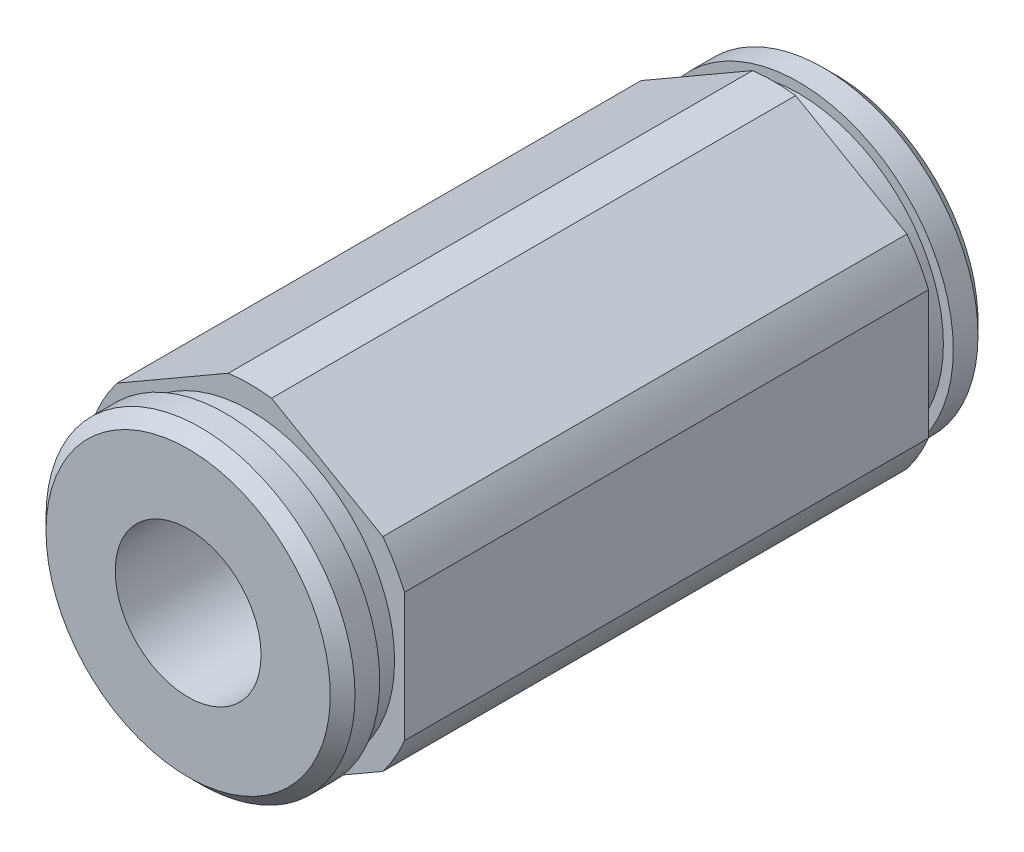
ISO-10303-21;
HEADER;
FILE_DESCRIPTION(('STEP AP214'),'2;1');
FILE_NAME('part.step','',(''),(''),'','','');
FILE_SCHEMA(('AUTOMOTIVE_DESIGN { 1 0 10303 214 1 1 1 1 }'));
ENDSEC;
DATA;
#1=APPLICATION_CONTEXT('core data for automotive mechanical design processes');
#2=APPLICATION_PROTOCOL_DEFINITION('international standard','automotive_design',2000,#1);
#3=PRODUCT_CONTEXT('',#1,'mechanical');
#4=PRODUCT('Part','Part','',(#3));
#5=PRODUCT_RELATED_PRODUCT_CATEGORY('part','',(#4));
#6=PRODUCT_DEFINITION_FORMATION('','',#4);
#7=PRODUCT_DEFINITION_CONTEXT('part definition',#1,'design');
#8=PRODUCT_DEFINITION('design','',#6,#7);
#9=PRODUCT_DEFINITION_SHAPE('','',#8);
#10=(LENGTH_UNIT() NAMED_UNIT(*) SI_UNIT(.MILLI.,.METRE.));
#11=(NAMED_UNIT(*) PLANE_ANGLE_UNIT() SI_UNIT($,.RADIAN.));
#12=(NAMED_UNIT(*) SI_UNIT($,.STERADIAN.) SOLID_ANGLE_UNIT());
#13=UNCERTAINTY_MEASURE_WITH_UNIT(LENGTH_MEASURE(1.E-05),#10,'distance_accuracy_value','');
#14=(GEOMETRIC_REPRESENTATION_CONTEXT(3) GLOBAL_UNCERTAINTY_ASSIGNED_CONTEXT((#13)) GLOBAL_UNIT_ASSIGNED_CONTEXT((#10,
#11,#12)) REPRESENTATION_CONTEXT('',''));
#15=CARTESIAN_POINT('',(0.,0.,0.));
#16=DIRECTION('',(0.,0.,1.));
#17=DIRECTION('',(1.,0.,0.));
#18=AXIS2_PLACEMENT_3D('',#15,#16,#17);
#19=CARTESIAN_POINT('',(0.,0.,10.7696));
#20=DIRECTION('',(0.,0.,1.));
#21=DIRECTION('',(1.,0.,0.));
#22=AXIS2_PLACEMENT_3D('',#19,#20,#21);
#23=PLANE('',#22);
#24=CARTESIAN_POINT('',(0.,0.,10.7696));
#25=DIRECTION('',(0.,0.,-1.));
#26=DIRECTION('',(-1.,0.,0.));
#27=AXIS2_PLACEMENT_3D('',#24,#25,#26);
#28=CIRCLE('',#27,5.9436);
#29=CARTESIAN_POINT('',(-5.9436,0.,10.7696));
#30=VERTEX_POINT('',#29);
#31=EDGE_CURVE('E172',#30,#30,#28,.T.);
#32=ORIENTED_EDGE('',*,*,#31,.T.);
#33=EDGE_LOOP('',(#32));
#34=FACE_BOUND('',#33,.T.);
#35=CARTESIAN_POINT('',(0.,0.,10.7696));
#36=DIRECTION('',(0.,0.,1.));
#37=DIRECTION('',(1.,0.,0.));
#38=AXIS2_PLACEMENT_3D('',#35,#36,#37);
#39=CIRCLE('',#38,6.87705);
#40=CARTESIAN_POINT('',(5.46158862213451,-4.17909875751589,10.7696));
#41=VERTEX_POINT('',#40);
#42=CARTESIAN_POINT('',(6.35,-2.64032511303059,10.7696));
#43=VERTEX_POINT('',#42);
#44=EDGE_CURVE('E144',#41,#43,#39,.T.);
#45=ORIENTED_EDGE('',*,*,#44,.T.);
#46=DIRECTION('',(0.,1.,0.));
#47=VECTOR('',#46,1.);
#48=CARTESIAN_POINT('',(6.35,-2.64032511303059,10.7696));
#49=LINE('',#48,#47);
#50=CARTESIAN_POINT('',(6.35,2.64032511303059,10.7696));
#51=VERTEX_POINT('',#50);
#52=EDGE_CURVE('E138',#43,#51,#49,.T.);
#53=ORIENTED_EDGE('',*,*,#52,.T.);
#54=CARTESIAN_POINT('',(0.,0.,10.7696));
#55=DIRECTION('',(0.,0.,1.));
#56=DIRECTION('',(1.,0.,0.));
#57=AXIS2_PLACEMENT_3D('',#54,#55,#56);
#58=CIRCLE('',#57,6.87705);
#59=CARTESIAN_POINT('',(5.46158862213451,4.17909875751589,10.7696));
#60=VERTEX_POINT('',#59);
#61=EDGE_CURVE('E141',#51,#60,#58,.T.);
#62=ORIENTED_EDGE('',*,*,#61,.T.);
#63=DIRECTION('',(-0.866025403784439,0.499999999999999,0.));
#64=VECTOR('',#63,1.);
#65=CARTESIAN_POINT('',(5.46158862213451,4.17909875751589,10.7696));
#66=LINE('',#65,#64);
#67=CARTESIAN_POINT('',(0.888411377865485,6.81942387054648,10.7696));
#68=VERTEX_POINT('',#67);
#69=EDGE_CURVE('E59',#60,#68,#66,.T.);
#70=ORIENTED_EDGE('',*,*,#69,.T.);
#71=CARTESIAN_POINT('',(0.,0.,10.7696));
#72=DIRECTION('',(0.,0.,1.));
#73=DIRECTION('',(1.,0.,0.));
#74=AXIS2_PLACEMENT_3D('',#71,#72,#73);
#75=CIRCLE('',#74,6.87705);
#76=CARTESIAN_POINT('',(-0.88841137786549,6.81942387054648,10.7696));
#77=VERTEX_POINT('',#76);
#78=EDGE_CURVE('E207',#68,#77,#75,.T.);
#79=ORIENTED_EDGE('',*,*,#78,.T.);
#80=DIRECTION('',(-0.866025403784439,-0.5,0.));
#81=VECTOR('',#80,1.);
#82=CARTESIAN_POINT('',(-0.88841137786549,6.81942387054648,10.7696));
#83=LINE('',#82,#81);
#84=CARTESIAN_POINT('',(-5.46158862213451,4.17909875751589,10.7696));
#85=VERTEX_POINT('',#84);
#86=EDGE_CURVE('E113',#77,#85,#83,.T.);
#87=ORIENTED_EDGE('',*,*,#86,.T.);
#88=CARTESIAN_POINT('',(0.,0.,10.7696));
#89=DIRECTION('',(0.,0.,1.));
#90=DIRECTION('',(1.,0.,0.));
#91=AXIS2_PLACEMENT_3D('',#88,#89,#90);
#92=CIRCLE('',#91,6.87705);
#93=CARTESIAN_POINT('',(-6.35,2.64032511303059,10.7696));
#94=VERTEX_POINT('',#93);
#95=EDGE_CURVE('E261',#85,#94,#92,.T.);
#96=ORIENTED_EDGE('',*,*,#95,.T.);
#97=DIRECTION('',(0.,-1.,0.));
#98=VECTOR('',#97,1.);
#99=CARTESIAN_POINT('',(-6.35,2.64032511303059,10.7696));
#100=LINE('',#99,#98);
#101=CARTESIAN_POINT('',(-6.35,-2.64032511303059,10.7696));
#102=VERTEX_POINT('',#101);
#103=EDGE_CURVE('E257',#94,#102,#100,.T.);
#104=ORIENTED_EDGE('',*,*,#103,.T.);
#105=CARTESIAN_POINT('',(0.,0.,10.7696));
#106=DIRECTION('',(0.,0.,1.));
#107=DIRECTION('',(1.,0.,0.));
#108=AXIS2_PLACEMENT_3D('',#105,#106,#107);
#109=CIRCLE('',#108,6.87705);
#110=CARTESIAN_POINT('',(-5.46158862213451,-4.17909875751589,10.7696));
#111=VERTEX_POINT('',#110);
#112=EDGE_CURVE('E260',#102,#111,#109,.T.);
#113=ORIENTED_EDGE('',*,*,#112,.T.);
#114=DIRECTION('',(0.866025403784438,-0.5,0.));
#115=VECTOR('',#114,1.);
#116=CARTESIAN_POINT('',(-5.46158862213451,-4.17909875751589,10.7696));
#117=LINE('',#116,#115);
#118=CARTESIAN_POINT('',(-0.888411377865495,-6.81942387054648,10.7696));
#119=VERTEX_POINT('',#118);
#120=EDGE_CURVE('E265',#111,#119,#117,.T.);
#121=ORIENTED_EDGE('',*,*,#120,.T.);
#122=CARTESIAN_POINT('',(0.,0.,10.7696));
#123=DIRECTION('',(0.,0.,1.));
#124=DIRECTION('',(1.,0.,0.));
#125=AXIS2_PLACEMENT_3D('',#122,#123,#124);
#126=CIRCLE('',#125,6.87705);
#127=CARTESIAN_POINT('',(0.888411377865487,-6.81942387054648,10.7696));
#128=VERTEX_POINT('',#127);
#129=EDGE_CURVE('E272',#119,#128,#126,.T.);
#130=ORIENTED_EDGE('',*,*,#129,.T.);
#131=DIRECTION('',(0.866025403784439,0.5,0.));
#132=VECTOR('',#131,1.);
#133=CARTESIAN_POINT('',(0.88841137786549,-6.81942387054648,10.7696));
#134=LINE('',#133,#132);
#135=EDGE_CURVE('E275',#128,#41,#134,.T.);
#136=ORIENTED_EDGE('',*,*,#135,.T.);
#137=EDGE_LOOP('',(#45,#53,#62,#70,#79,#87,#96,#104,#113,#121,#130,#136));
#138=FACE_BOUND('',#137,.T.);
#139=ADVANCED_FACE('F41',(#34,#138),#23,.T.);
#140=CARTESIAN_POINT('',(-0.88841137786549,6.81942387054648,10.7696));
#141=DIRECTION('',(0.5,-0.866025403784439,0.));
#142=DIRECTION('',(0.866025403784439,0.5,0.));
#143=AXIS2_PLACEMENT_3D('',#140,#141,#142);
#144=PLANE('',#143);
#145=DIRECTION('',(0.,0.,-1.));
#146=VECTOR('',#145,1.);
#147=CARTESIAN_POINT('',(-5.46158862213451,4.17909875751589,10.7696));
#148=LINE('',#147,#146);
#149=CARTESIAN_POINT('',(-5.46158862213451,4.17909875751589,-10.7696));
#150=VERTEX_POINT('',#149);
#151=EDGE_CURVE('E237',#85,#150,#148,.T.);
#152=ORIENTED_EDGE('',*,*,#151,.F.);
#153=ORIENTED_EDGE('',*,*,#86,.F.);
#154=DIRECTION('',(0.,0.,-1.));
#155=VECTOR('',#154,1.);
#156=CARTESIAN_POINT('',(-0.88841137786549,6.81942387054648,10.7696));
#157=LINE('',#156,#155);
#158=CARTESIAN_POINT('',(-0.88841137786549,6.81942387054648,-10.7696));
#159=VERTEX_POINT('',#158);
#160=EDGE_CURVE('E44',#77,#159,#157,.T.);
#161=ORIENTED_EDGE('',*,*,#160,.T.);
#162=DIRECTION('',(-0.866025403784439,-0.5,0.));
#163=VECTOR('',#162,1.);
#164=CARTESIAN_POINT('',(-0.88841137786549,6.81942387054648,-10.7696));
#165=LINE('',#164,#163);
#166=EDGE_CURVE('E171',#159,#150,#165,.T.);
#167=ORIENTED_EDGE('',*,*,#166,.T.);
#168=EDGE_LOOP('',(#152,#153,#161,#167));
#169=FACE_BOUND('',#168,.T.);
#170=ADVANCED_FACE('F245',(#169),#144,.F.);
#171=CARTESIAN_POINT('',(-6.35,2.64032511303059,10.7696));
#172=DIRECTION('',(1.,0.,0.));
#173=DIRECTION('',(0.,0.,-1.));
#174=AXIS2_PLACEMENT_3D('',#171,#172,#173);
#175=PLANE('',#174);
#176=DIRECTION('',(0.,0.,-1.));
#177=VECTOR('',#176,1.);
#178=CARTESIAN_POINT('',(-6.35,-2.64032511303059,10.7696));
#179=LINE('',#178,#177);
#180=CARTESIAN_POINT('',(-6.35,-2.64032511303059,-10.7696));
#181=VERTEX_POINT('',#180);
#182=EDGE_CURVE('E230',#102,#181,#179,.T.);
#183=ORIENTED_EDGE('',*,*,#182,.F.);
#184=ORIENTED_EDGE('',*,*,#103,.F.);
#185=DIRECTION('',(0.,0.,-1.));
#186=VECTOR('',#185,1.);
#187=CARTESIAN_POINT('',(-6.35,2.64032511303059,10.7696));
#188=LINE('',#187,#186);
#189=CARTESIAN_POINT('',(-6.35,2.64032511303059,-10.7696));
#190=VERTEX_POINT('',#189);
#191=EDGE_CURVE('E234',#94,#190,#188,.T.);
#192=ORIENTED_EDGE('',*,*,#191,.T.);
#193=DIRECTION('',(0.,-1.,0.));
#194=VECTOR('',#193,1.);
#195=CARTESIAN_POINT('',(-6.35,2.64032511303059,-10.7696));
#196=LINE('',#195,#194);
#197=EDGE_CURVE('E179',#190,#181,#196,.T.);
#198=ORIENTED_EDGE('',*,*,#197,.T.);
#199=EDGE_LOOP('',(#183,#184,#192,#198));
#200=FACE_BOUND('',#199,.T.);
#201=ADVANCED_FACE('F256',(#200),#175,.F.);
#202=CARTESIAN_POINT('',(-5.46158862213451,-4.17909875751589,10.7696));
#203=DIRECTION('',(0.5,0.866025403784439,0.));
#204=DIRECTION('',(-0.866025403784439,0.5,0.));
#205=AXIS2_PLACEMENT_3D('',#202,#203,#204);
#206=PLANE('',#205);
#207=DIRECTION('',(0.,0.,-1.));
#208=VECTOR('',#207,1.);
#209=CARTESIAN_POINT('',(-0.888411377865495,-6.81942387054648,10.7696));
#210=LINE('',#209,#208);
#211=CARTESIAN_POINT('',(-0.888411377865495,-6.81942387054648,-10.7696));
#212=VERTEX_POINT('',#211);
#213=EDGE_CURVE('E222',#119,#212,#210,.T.);
#214=ORIENTED_EDGE('',*,*,#213,.F.);
#215=ORIENTED_EDGE('',*,*,#120,.F.);
#216=DIRECTION('',(0.,0.,-1.));
#217=VECTOR('',#216,1.);
#218=CARTESIAN_POINT('',(-5.46158862213451,-4.17909875751589,10.7696));
#219=LINE('',#218,#217);
#220=CARTESIAN_POINT('',(-5.46158862213451,-4.17909875751589,-10.7696));
#221=VERTEX_POINT('',#220);
#222=EDGE_CURVE('E226',#111,#221,#219,.T.);
#223=ORIENTED_EDGE('',*,*,#222,.T.);
#224=DIRECTION('',(0.866025403784438,-0.5,0.));
#225=VECTOR('',#224,1.);
#226=CARTESIAN_POINT('',(-5.46158862213451,-4.17909875751589,-10.7696));
#227=LINE('',#226,#225);
#228=EDGE_CURVE('E186',#221,#212,#227,.T.);
#229=ORIENTED_EDGE('',*,*,#228,.T.);
#230=EDGE_LOOP('',(#214,#215,#223,#229));
#231=FACE_BOUND('',#230,.T.);
#232=ADVANCED_FACE('F378',(#231),#206,.F.);
#233=CARTESIAN_POINT('',(0.88841137786549,-6.81942387054648,10.7696));
#234=DIRECTION('',(-0.5,0.866025403784439,0.));
#235=DIRECTION('',(-0.866025403784439,-0.5,0.));
#236=AXIS2_PLACEMENT_3D('',#233,#234,#235);
#237=PLANE('',#236);
#238=DIRECTION('',(0.,0.,-1.));
#239=VECTOR('',#238,1.);
#240=CARTESIAN_POINT('',(5.46158862213451,-4.17909875751589,10.7696));
#241=LINE('',#240,#239);
#242=CARTESIAN_POINT('',(5.46158862213451,-4.17909875751589,-10.7696));
#243=VERTEX_POINT('',#242);
#244=EDGE_CURVE('E214',#41,#243,#241,.T.);
#245=ORIENTED_EDGE('',*,*,#244,.F.);
#246=ORIENTED_EDGE('',*,*,#135,.F.);
#247=DIRECTION('',(0.,0.,-1.));
#248=VECTOR('',#247,1.);
#249=CARTESIAN_POINT('',(0.888411377865487,-6.81942387054648,10.7696));
#250=LINE('',#249,#248);
#251=CARTESIAN_POINT('',(0.888411377865487,-6.81942387054648,-10.7696));
#252=VERTEX_POINT('',#251);
#253=EDGE_CURVE('E218',#128,#252,#250,.T.);
#254=ORIENTED_EDGE('',*,*,#253,.T.);
#255=DIRECTION('',(0.866025403784439,0.5,0.));
#256=VECTOR('',#255,1.);
#257=CARTESIAN_POINT('',(0.88841137786549,-6.81942387054648,-10.7696));
#258=LINE('',#257,#256);
#259=EDGE_CURVE('E193',#252,#243,#258,.T.);
#260=ORIENTED_EDGE('',*,*,#259,.T.);
#261=EDGE_LOOP('',(#245,#246,#254,#260));
#262=FACE_BOUND('',#261,.T.);
#263=ADVANCED_FACE('F283',(#262),#237,.F.);
#264=CARTESIAN_POINT('',(6.35,-2.64032511303059,10.7696));
#265=DIRECTION('',(-1.,0.,0.));
#266=DIRECTION('',(0.,0.,1.));
#267=AXIS2_PLACEMENT_3D('',#264,#265,#266);
#268=PLANE('',#267);
#269=ORIENTED_EDGE('',*,*,#52,.F.);
#270=DIRECTION('',(0.,0.,-1.));
#271=VECTOR('',#270,1.);
#272=CARTESIAN_POINT('',(6.35,-2.64032511303059,10.7696));
#273=LINE('',#272,#271);
#274=CARTESIAN_POINT('',(6.35,-2.64032511303059,-10.7696));
#275=VERTEX_POINT('',#274);
#276=EDGE_CURVE('E156',#43,#275,#273,.T.);
#277=ORIENTED_EDGE('',*,*,#276,.T.);
#278=DIRECTION('',(0.,1.,0.));
#279=VECTOR('',#278,1.);
#280=CARTESIAN_POINT('',(6.35,-2.64032511303059,-10.7696));
#281=LINE('',#280,#279);
#282=CARTESIAN_POINT('',(6.35,2.64032511303059,-10.7696));
#283=VERTEX_POINT('',#282);
#284=EDGE_CURVE('E153',#275,#283,#281,.T.);
#285=ORIENTED_EDGE('',*,*,#284,.T.);
#286=DIRECTION('',(0.,0.,-1.));
#287=VECTOR('',#286,1.);
#288=CARTESIAN_POINT('',(6.35,2.64032511303059,10.7696));
#289=LINE('',#288,#287);
#290=EDGE_CURVE('E151',#51,#283,#289,.T.);
#291=ORIENTED_EDGE('',*,*,#290,.F.);
#292=EDGE_LOOP('',(#269,#277,#285,#291));
#293=FACE_BOUND('',#292,.T.);
#294=ADVANCED_FACE('F152',(#293),#268,.F.);
#295=CARTESIAN_POINT('',(5.46158862213451,4.17909875751589,10.7696));
#296=DIRECTION('',(-0.499999999999999,-0.866025403784439,0.));
#297=DIRECTION('',(0.866025403784439,-0.499999999999999,0.));
#298=AXIS2_PLACEMENT_3D('',#295,#296,#297);
#299=PLANE('',#298);
#300=DIRECTION('',(0.,0.,-1.));
#301=VECTOR('',#300,1.);
#302=CARTESIAN_POINT('',(0.888411377865485,6.81942387054648,10.7696));
#303=LINE('',#302,#301);
#304=CARTESIAN_POINT('',(0.888411377865485,6.81942387054648,-10.7696));
#305=VERTEX_POINT('',#304);
#306=EDGE_CURVE('E163',#68,#305,#303,.T.);
#307=ORIENTED_EDGE('',*,*,#306,.F.);
#308=ORIENTED_EDGE('',*,*,#69,.F.);
#309=DIRECTION('',(0.,0.,-1.));
#310=VECTOR('',#309,1.);
#311=CARTESIAN_POINT('',(5.46158862213451,4.17909875751589,10.7696));
#312=LINE('',#311,#310);
#313=CARTESIAN_POINT('',(5.46158862213451,4.17909875751589,-10.7696));
#314=VERTEX_POINT('',#313);
#315=EDGE_CURVE('E157',#60,#314,#312,.T.);
#316=ORIENTED_EDGE('',*,*,#315,.T.);
#317=DIRECTION('',(-0.866025403784439,0.499999999999999,0.));
#318=VECTOR('',#317,1.);
#319=CARTESIAN_POINT('',(5.46158862213451,4.17909875751589,-10.7696));
#320=LINE('',#319,#318);
#321=EDGE_CURVE('E100',#314,#305,#320,.T.);
#322=ORIENTED_EDGE('',*,*,#321,.T.);
#323=EDGE_LOOP('',(#307,#308,#316,#322));
#324=FACE_BOUND('',#323,.T.);
#325=ADVANCED_FACE('F288',(#324),#299,.F.);
#326=CARTESIAN_POINT('',(0.,0.,10.7696));
#327=DIRECTION('',(0.,0.,-1.));
#328=DIRECTION('',(-1.,0.,0.));
#329=AXIS2_PLACEMENT_3D('',#326,#327,#328);
#330=CYLINDRICAL_SURFACE('',#329,6.87705);
#331=CARTESIAN_POINT('',(0.,0.,-10.7696));
#332=DIRECTION('',(0.,0.,1.));
#333=DIRECTION('',(1.,0.,0.));
#334=AXIS2_PLACEMENT_3D('',#331,#332,#333);
#335=CIRCLE('',#334,6.87705);
#336=EDGE_CURVE('E167',#305,#159,#335,.T.);
#337=ORIENTED_EDGE('',*,*,#336,.T.);
#338=ORIENTED_EDGE('',*,*,#160,.F.);
#339=ORIENTED_EDGE('',*,*,#78,.F.);
#340=ORIENTED_EDGE('',*,*,#306,.T.);
#341=EDGE_LOOP('',(#337,#338,#339,#340));
#342=FACE_BOUND('',#341,.T.);
#343=ADVANCED_FACE('F248',(#342),#330,.T.);
#344=CARTESIAN_POINT('',(0.,0.,10.7696));
#345=DIRECTION('',(0.,0.,-1.));
#346=DIRECTION('',(-1.,0.,0.));
#347=AXIS2_PLACEMENT_3D('',#344,#345,#346);
#348=CYLINDRICAL_SURFACE('',#347,6.87705);
#349=CARTESIAN_POINT('',(0.,0.,-10.7696));
#350=DIRECTION('',(0.,0.,1.));
#351=DIRECTION('',(1.,0.,0.));
#352=AXIS2_PLACEMENT_3D('',#349,#350,#351);
#353=CIRCLE('',#352,6.87705);
#354=EDGE_CURVE('E175',#150,#190,#353,.T.);
#355=ORIENTED_EDGE('',*,*,#354,.T.);
#356=ORIENTED_EDGE('',*,*,#191,.F.);
#357=ORIENTED_EDGE('',*,*,#95,.F.);
#358=ORIENTED_EDGE('',*,*,#151,.T.);
#359=EDGE_LOOP('',(#355,#356,#357,#358));
#360=FACE_BOUND('',#359,.T.);
#361=ADVANCED_FACE('F252',(#360),#348,.T.);
#362=CARTESIAN_POINT('',(0.,0.,10.7696));
#363=DIRECTION('',(0.,0.,-1.));
#364=DIRECTION('',(-1.,0.,0.));
#365=AXIS2_PLACEMENT_3D('',#362,#363,#364);
#366=CYLINDRICAL_SURFACE('',#365,6.87705);
#367=CARTESIAN_POINT('',(0.,0.,-10.7696));
#368=DIRECTION('',(0.,0.,1.));
#369=DIRECTION('',(1.,0.,0.));
#370=AXIS2_PLACEMENT_3D('',#367,#368,#369);
#371=CIRCLE('',#370,6.87705);
#372=EDGE_CURVE('E182',#181,#221,#371,.T.);
#373=ORIENTED_EDGE('',*,*,#372,.T.);
#374=ORIENTED_EDGE('',*,*,#222,.F.);
#375=ORIENTED_EDGE('',*,*,#112,.F.);
#376=ORIENTED_EDGE('',*,*,#182,.T.);
#377=EDGE_LOOP('',(#373,#374,#375,#376));
#378=FACE_BOUND('',#377,.T.);
#379=ADVANCED_FACE('F415',(#378),#366,.T.);
#380=CARTESIAN_POINT('',(0.,0.,10.7696));
#381=DIRECTION('',(0.,0.,-1.));
#382=DIRECTION('',(-1.,0.,0.));
#383=AXIS2_PLACEMENT_3D('',#380,#381,#382);
#384=CYLINDRICAL_SURFACE('',#383,6.87705);
#385=CARTESIAN_POINT('',(0.,0.,-10.7696));
#386=DIRECTION('',(0.,0.,1.));
#387=DIRECTION('',(1.,0.,0.));
#388=AXIS2_PLACEMENT_3D('',#385,#386,#387);
#389=CIRCLE('',#388,6.87705);
#390=EDGE_CURVE('E189',#212,#252,#389,.T.);
#391=ORIENTED_EDGE('',*,*,#390,.T.);
#392=ORIENTED_EDGE('',*,*,#253,.F.);
#393=ORIENTED_EDGE('',*,*,#129,.F.);
#394=ORIENTED_EDGE('',*,*,#213,.T.);
#395=EDGE_LOOP('',(#391,#392,#393,#394));
#396=FACE_BOUND('',#395,.T.);
#397=ADVANCED_FACE('F410',(#396),#384,.T.);
#398=CARTESIAN_POINT('',(0.,0.,10.7696));
#399=DIRECTION('',(0.,0.,-1.));
#400=DIRECTION('',(-1.,0.,0.));
#401=AXIS2_PLACEMENT_3D('',#398,#399,#400);
#402=CYLINDRICAL_SURFACE('',#401,6.87705);
#403=CARTESIAN_POINT('',(0.,0.,-10.7696));
#404=DIRECTION('',(0.,0.,1.));
#405=DIRECTION('',(1.,0.,0.));
#406=AXIS2_PLACEMENT_3D('',#403,#404,#405);
#407=CIRCLE('',#406,6.87705);
#408=EDGE_CURVE('E196',#243,#275,#407,.T.);
#409=ORIENTED_EDGE('',*,*,#408,.T.);
#410=ORIENTED_EDGE('',*,*,#276,.F.);
#411=ORIENTED_EDGE('',*,*,#44,.F.);
#412=ORIENTED_EDGE('',*,*,#244,.T.);
#413=EDGE_LOOP('',(#409,#410,#411,#412));
#414=FACE_BOUND('',#413,.T.);
#415=ADVANCED_FACE('F286',(#414),#402,.T.);
#416=CARTESIAN_POINT('',(0.,0.,10.7696));
#417=DIRECTION('',(0.,0.,-1.));
#418=DIRECTION('',(-1.,0.,0.));
#419=AXIS2_PLACEMENT_3D('',#416,#417,#418);
#420=CYLINDRICAL_SURFACE('',#419,6.87705);
#421=CARTESIAN_POINT('',(0.,0.,-10.7696));
#422=DIRECTION('',(0.,0.,1.));
#423=DIRECTION('',(1.,0.,0.));
#424=AXIS2_PLACEMENT_3D('',#421,#422,#423);
#425=CIRCLE('',#424,6.87705);
#426=EDGE_CURVE('E202',#283,#314,#425,.T.);
#427=ORIENTED_EDGE('',*,*,#426,.T.);
#428=ORIENTED_EDGE('',*,*,#315,.F.);
#429=ORIENTED_EDGE('',*,*,#61,.F.);
#430=ORIENTED_EDGE('',*,*,#290,.T.);
#431=EDGE_LOOP('',(#427,#428,#429,#430));
#432=FACE_BOUND('',#431,.T.);
#433=ADVANCED_FACE('F159',(#432),#420,.T.);
#434=CARTESIAN_POINT('',(0.,0.,-10.7696));
#435=DIRECTION('',(0.,0.,1.));
#436=DIRECTION('',(1.,0.,0.));
#437=AXIS2_PLACEMENT_3D('',#434,#435,#436);
#438=PLANE('',#437);
#439=CARTESIAN_POINT('',(0.,0.,-10.7696));
#440=DIRECTION('',(0.,0.,-1.));
#441=DIRECTION('',(-1.,0.,0.));
#442=AXIS2_PLACEMENT_3D('',#439,#440,#441);
#443=CIRCLE('',#442,5.9436);
#444=CARTESIAN_POINT('',(-5.9436,0.,-10.7696));
#445=VERTEX_POINT('',#444);
#446=EDGE_CURVE('E11',#445,#445,#443,.T.);
#447=ORIENTED_EDGE('',*,*,#446,.F.);
#448=EDGE_LOOP('',(#447));
#449=FACE_BOUND('',#448,.T.);
#450=ORIENTED_EDGE('',*,*,#321,.F.);
#451=ORIENTED_EDGE('',*,*,#426,.F.);
#452=ORIENTED_EDGE('',*,*,#284,.F.);
#453=ORIENTED_EDGE('',*,*,#408,.F.);
#454=ORIENTED_EDGE('',*,*,#259,.F.);
#455=ORIENTED_EDGE('',*,*,#390,.F.);
#456=ORIENTED_EDGE('',*,*,#228,.F.);
#457=ORIENTED_EDGE('',*,*,#372,.F.);
#458=ORIENTED_EDGE('',*,*,#197,.F.);
#459=ORIENTED_EDGE('',*,*,#354,.F.);
#460=ORIENTED_EDGE('',*,*,#166,.F.);
#461=ORIENTED_EDGE('',*,*,#336,.F.);
#462=EDGE_LOOP('',(#450,#451,#452,#453,#454,#455,#456,#457,#458,#459,#460,#461));
#463=FACE_BOUND('',#462,.T.);
#464=ADVANCED_FACE('F249',(#449,#463),#438,.F.);
#465=CARTESIAN_POINT('',(0.,0.,-38.2778));
#466=DIRECTION('',(0.,0.,-1.));
#467=DIRECTION('',(-1.,0.,0.));
#468=AXIS2_PLACEMENT_3D('',#465,#466,#467);
#469=CYLINDRICAL_SURFACE('',#468,5.9436);
#470=CARTESIAN_POINT('',(0.,0.,11.7856));
#471=DIRECTION('',(0.,0.,-1.));
#472=DIRECTION('',(-1.,0.,0.));
#473=AXIS2_PLACEMENT_3D('',#470,#471,#472);
#474=CIRCLE('',#473,5.9436);
#475=CARTESIAN_POINT('',(-5.9436,0.,11.7856));
#476=VERTEX_POINT('',#475);
#477=EDGE_CURVE('E296',#476,#476,#474,.T.);
#478=ORIENTED_EDGE('',*,*,#477,.T.);
#479=EDGE_LOOP('',(#478));
#480=FACE_BOUND('',#479,.T.);
#481=ORIENTED_EDGE('',*,*,#31,.F.);
#482=EDGE_LOOP('',(#481));
#483=FACE_BOUND('',#482,.T.);
#484=ADVANCED_FACE('F361',(#480,#483),#469,.T.);
#485=CARTESIAN_POINT('',(0.,5.9436,11.7856));
#486=DIRECTION('',(0.,0.,-1.));
#487=DIRECTION('',(-1.,0.,0.));
#488=AXIS2_PLACEMENT_3D('',#485,#486,#487);
#489=PLANE('',#488);
#490=CARTESIAN_POINT('',(0.,0.,11.7856));
#491=DIRECTION('',(0.,0.,-1.));
#492=DIRECTION('',(-1.,0.,0.));
#493=AXIS2_PLACEMENT_3D('',#490,#491,#492);
#494=CIRCLE('',#493,6.35);
#495=CARTESIAN_POINT('',(-6.35,0.,11.7856));
#496=VERTEX_POINT('',#495);
#497=EDGE_CURVE('E300',#496,#496,#494,.T.);
#498=ORIENTED_EDGE('',*,*,#497,.T.);
#499=EDGE_LOOP('',(#498));
#500=FACE_BOUND('',#499,.T.);
#501=ORIENTED_EDGE('',*,*,#477,.F.);
#502=EDGE_LOOP('',(#501));
#503=FACE_BOUND('',#502,.T.);
#504=ADVANCED_FACE('F355',(#500,#503),#489,.T.);
#505=CARTESIAN_POINT('',(0.,0.,-38.2778));
#506=DIRECTION('',(0.,0.,-1.));
#507=DIRECTION('',(-1.,0.,0.));
#508=AXIS2_PLACEMENT_3D('',#505,#506,#507);
#509=CYLINDRICAL_SURFACE('',#508,6.35);
#510=CARTESIAN_POINT('',(0.,0.,12.8016));
#511=DIRECTION('',(0.,0.,-1.));
#512=DIRECTION('',(-1.,0.,0.));
#513=AXIS2_PLACEMENT_3D('',#510,#511,#512);
#514=CIRCLE('',#513,6.35);
#515=CARTESIAN_POINT('',(-6.35,0.,12.8016));
#516=VERTEX_POINT('',#515);
#517=EDGE_CURVE('E304',#516,#516,#514,.T.);
#518=ORIENTED_EDGE('',*,*,#517,.T.);
#519=EDGE_LOOP('',(#518));
#520=FACE_BOUND('',#519,.T.);
#521=ORIENTED_EDGE('',*,*,#497,.F.);
#522=EDGE_LOOP('',(#521));
#523=FACE_BOUND('',#522,.T.);
#524=ADVANCED_FACE('F349',(#520,#523),#509,.T.);
#525=CARTESIAN_POINT('',(0.,0.,12.8016));
#526=DIRECTION('',(0.,0.,-1.));
#527=DIRECTION('',(-1.,0.,0.));
#528=AXIS2_PLACEMENT_3D('',#525,#526,#527);
#529=CONICAL_SURFACE('',#528,6.35,0.785398163397447);
#530=CARTESIAN_POINT('',(0.,0.,13.3096));
#531=DIRECTION('',(0.,0.,-1.));
#532=DIRECTION('',(-1.,0.,0.));
#533=AXIS2_PLACEMENT_3D('',#530,#531,#532);
#534=CIRCLE('',#533,5.842);
#535=CARTESIAN_POINT('',(-5.842,0.,13.3096));
#536=VERTEX_POINT('',#535);
#537=EDGE_CURVE('E308',#536,#536,#534,.T.);
#538=ORIENTED_EDGE('',*,*,#537,.T.);
#539=EDGE_LOOP('',(#538));
#540=FACE_BOUND('',#539,.T.);
#541=ORIENTED_EDGE('',*,*,#517,.F.);
#542=EDGE_LOOP('',(#541));
#543=FACE_BOUND('',#542,.T.);
#544=ADVANCED_FACE('F343',(#540,#543),#529,.T.);
#545=CARTESIAN_POINT('',(0.,5.842,13.3096));
#546=DIRECTION('',(0.,0.,1.));
#547=DIRECTION('',(1.,0.,0.));
#548=AXIS2_PLACEMENT_3D('',#545,#546,#547);
#549=PLANE('',#548);
#550=CARTESIAN_POINT('',(0.,0.,13.3096));
#551=DIRECTION('',(0.,0.,1.));
#552=DIRECTION('',(1.,0.,0.));
#553=AXIS2_PLACEMENT_3D('',#550,#551,#552);
#554=CIRCLE('',#553,2.9972);
#555=CARTESIAN_POINT('',(2.9972,0.,13.3096));
#556=VERTEX_POINT('',#555);
#557=EDGE_CURVE('E332',#556,#556,#554,.T.);
#558=ORIENTED_EDGE('',*,*,#557,.F.);
#559=EDGE_LOOP('',(#558));
#560=FACE_BOUND('',#559,.T.);
#561=ORIENTED_EDGE('',*,*,#537,.F.);
#562=EDGE_LOOP('',(#561));
#563=FACE_BOUND('',#562,.T.);
#564=ADVANCED_FACE('F339',(#560,#563),#549,.T.);
#565=CARTESIAN_POINT('',(0.,0.,38.2778));
#566=DIRECTION('',(0.,0.,1.));
#567=DIRECTION('',(-1.,0.,0.));
#568=AXIS2_PLACEMENT_3D('',#565,#566,#567);
#569=CYLINDRICAL_SURFACE('',#568,5.9436);
#570=CARTESIAN_POINT('',(0.,0.,-11.7856));
#571=DIRECTION('',(0.,0.,-1.));
#572=DIRECTION('',(-1.,0.,0.));
#573=AXIS2_PLACEMENT_3D('',#570,#571,#572);
#574=CIRCLE('',#573,5.9436);
#575=CARTESIAN_POINT('',(-5.9436,0.,-11.7856));
#576=VERTEX_POINT('',#575);
#577=EDGE_CURVE('E311',#576,#576,#574,.T.);
#578=ORIENTED_EDGE('',*,*,#577,.F.);
#579=EDGE_LOOP('',(#578));
#580=FACE_BOUND('',#579,.T.);
#581=ORIENTED_EDGE('',*,*,#446,.T.);
#582=EDGE_LOOP('',(#581));
#583=FACE_BOUND('',#582,.T.);
#584=ADVANCED_FACE('F342',(#580,#583),#569,.T.);
#585=CARTESIAN_POINT('',(0.,5.9436,-11.7856));
#586=DIRECTION('',(0.,0.,1.));
#587=DIRECTION('',(-1.,0.,0.));
#588=AXIS2_PLACEMENT_3D('',#585,#586,#587);
#589=PLANE('',#588);
#590=CARTESIAN_POINT('',(0.,0.,-11.7856));
#591=DIRECTION('',(0.,0.,-1.));
#592=DIRECTION('',(-1.,0.,0.));
#593=AXIS2_PLACEMENT_3D('',#590,#591,#592);
#594=CIRCLE('',#593,6.35);
#595=CARTESIAN_POINT('',(-6.35,0.,-11.7856));
#596=VERTEX_POINT('',#595);
#597=EDGE_CURVE('E316',#596,#596,#594,.T.);
#598=ORIENTED_EDGE('',*,*,#597,.F.);
#599=EDGE_LOOP('',(#598));
#600=FACE_BOUND('',#599,.T.);
#601=ORIENTED_EDGE('',*,*,#577,.T.);
#602=EDGE_LOOP('',(#601));
#603=FACE_BOUND('',#602,.T.);
#604=ADVANCED_FACE('F392',(#600,#603),#589,.T.);
#605=CARTESIAN_POINT('',(0.,0.,38.2778));
#606=DIRECTION('',(0.,0.,1.));
#607=DIRECTION('',(-1.,0.,0.));
#608=AXIS2_PLACEMENT_3D('',#605,#606,#607);
#609=CYLINDRICAL_SURFACE('',#608,6.35);
#610=CARTESIAN_POINT('',(0.,0.,-12.8016));
#611=DIRECTION('',(0.,0.,-1.));
#612=DIRECTION('',(-1.,0.,0.));
#613=AXIS2_PLACEMENT_3D('',#610,#611,#612);
#614=CIRCLE('',#613,6.35);
#615=CARTESIAN_POINT('',(-6.35,0.,-12.8016));
#616=VERTEX_POINT('',#615);
#617=EDGE_CURVE('E320',#616,#616,#614,.T.);
#618=ORIENTED_EDGE('',*,*,#617,.F.);
#619=EDGE_LOOP('',(#618));
#620=FACE_BOUND('',#619,.T.);
#621=ORIENTED_EDGE('',*,*,#597,.T.);
#622=EDGE_LOOP('',(#621));
#623=FACE_BOUND('',#622,.T.);
#624=ADVANCED_FACE('F398',(#620,#623),#609,.T.);
#625=CARTESIAN_POINT('',(0.,0.,-12.8016));
#626=DIRECTION('',(0.,0.,1.));
#627=DIRECTION('',(-1.,0.,0.));
#628=AXIS2_PLACEMENT_3D('',#625,#626,#627);
#629=CONICAL_SURFACE('',#628,6.35,0.785398163397447);
#630=CARTESIAN_POINT('',(0.,0.,-13.3096));
#631=DIRECTION('',(0.,0.,-1.));
#632=DIRECTION('',(-1.,0.,0.));
#633=AXIS2_PLACEMENT_3D('',#630,#631,#632);
#634=CIRCLE('',#633,5.842);
#635=CARTESIAN_POINT('',(-5.842,0.,-13.3096));
#636=VERTEX_POINT('',#635);
#637=EDGE_CURVE('E324',#636,#636,#634,.T.);
#638=ORIENTED_EDGE('',*,*,#637,.F.);
#639=EDGE_LOOP('',(#638));
#640=FACE_BOUND('',#639,.T.);
#641=ORIENTED_EDGE('',*,*,#617,.T.);
#642=EDGE_LOOP('',(#641));
#643=FACE_BOUND('',#642,.T.);
#644=ADVANCED_FACE('F523',(#640,#643),#629,.T.);
#645=CARTESIAN_POINT('',(0.,5.842,-13.3096));
#646=DIRECTION('',(0.,0.,-1.));
#647=DIRECTION('',(1.,0.,0.));
#648=AXIS2_PLACEMENT_3D('',#645,#646,#647);
#649=PLANE('',#648);
#650=CARTESIAN_POINT('',(0.,0.,-13.3096));
#651=DIRECTION('',(0.,0.,1.));
#652=DIRECTION('',(1.,0.,0.));
#653=AXIS2_PLACEMENT_3D('',#650,#651,#652);
#654=CIRCLE('',#653,2.9972);
#655=CARTESIAN_POINT('',(2.9972,0.,-13.3096));
#656=VERTEX_POINT('',#655);
#657=EDGE_CURVE('E328',#656,#656,#654,.T.);
#658=ORIENTED_EDGE('',*,*,#657,.T.);
#659=EDGE_LOOP('',(#658));
#660=FACE_BOUND('',#659,.T.);
#661=ORIENTED_EDGE('',*,*,#637,.T.);
#662=EDGE_LOOP('',(#661));
#663=FACE_BOUND('',#662,.T.);
#664=ADVANCED_FACE('F530',(#660,#663),#649,.T.);
#665=CARTESIAN_POINT('',(0.,0.,-13.3096));
#666=DIRECTION('',(0.,0.,1.));
#667=DIRECTION('',(1.,0.,0.));
#668=AXIS2_PLACEMENT_3D('',#665,#666,#667);
#669=CYLINDRICAL_SURFACE('',#668,2.9972);
#670=ORIENTED_EDGE('',*,*,#657,.F.);
#671=EDGE_LOOP('',(#670));
#672=FACE_BOUND('',#671,.T.);
#673=ORIENTED_EDGE('',*,*,#557,.T.);
#674=EDGE_LOOP('',(#673));
#675=FACE_BOUND('',#674,.T.);
#676=ADVANCED_FACE('F337',(#672,#675),#669,.F.);
#677=CLOSED_SHELL('',(#139,#170,#201,#232,#263,#294,#325,#343,#361,#379,#397,#415,#433,#464,
#484,#504,#524,#544,#564,#584,#604,#624,#644,#664,#676));
#678=MANIFOLD_SOLID_BREP('B2',#677);
#679=ADVANCED_BREP_SHAPE_REPRESENTATION('',(#18,#678),#14);
#680=SHAPE_DEFINITION_REPRESENTATION(#9,#679);
ENDSEC;
END-ISO-10303-21;
